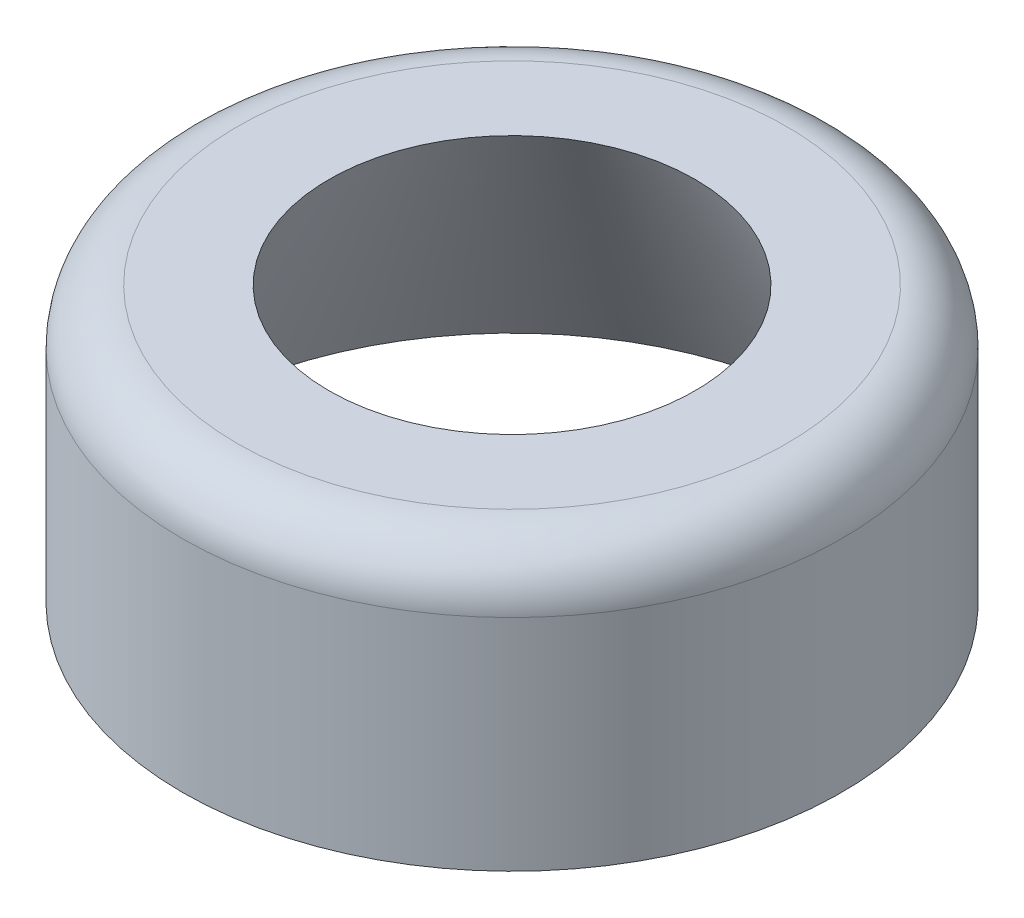
ISO-10303-21;
HEADER;
FILE_DESCRIPTION(('STEP AP214'),'2;1');
FILE_NAME('part.step','',(''),(''),'','','');
FILE_SCHEMA(('AUTOMOTIVE_DESIGN { 1 0 10303 214 1 1 1 1 }'));
ENDSEC;
DATA;
#1=APPLICATION_CONTEXT('core data for automotive mechanical design processes');
#2=APPLICATION_PROTOCOL_DEFINITION('international standard','automotive_design',2000,#1);
#3=PRODUCT_CONTEXT('',#1,'mechanical');
#4=PRODUCT('Part','Part','',(#3));
#5=PRODUCT_RELATED_PRODUCT_CATEGORY('part','',(#4));
#6=PRODUCT_DEFINITION_FORMATION('','',#4);
#7=PRODUCT_DEFINITION_CONTEXT('part definition',#1,'design');
#8=PRODUCT_DEFINITION('design','',#6,#7);
#9=PRODUCT_DEFINITION_SHAPE('','',#8);
#10=(LENGTH_UNIT() NAMED_UNIT(*) SI_UNIT(.MILLI.,.METRE.));
#11=(NAMED_UNIT(*) PLANE_ANGLE_UNIT() SI_UNIT($,.RADIAN.));
#12=(NAMED_UNIT(*) SI_UNIT($,.STERADIAN.) SOLID_ANGLE_UNIT());
#13=UNCERTAINTY_MEASURE_WITH_UNIT(LENGTH_MEASURE(1.E-05),#10,'distance_accuracy_value','');
#14=(GEOMETRIC_REPRESENTATION_CONTEXT(3) GLOBAL_UNCERTAINTY_ASSIGNED_CONTEXT((#13)) GLOBAL_UNIT_ASSIGNED_CONTEXT((#10,
#11,#12)) REPRESENTATION_CONTEXT('',''));
#15=CARTESIAN_POINT('',(0.,0.,0.));
#16=DIRECTION('',(0.,0.,1.));
#17=DIRECTION('',(1.,0.,0.));
#18=AXIS2_PLACEMENT_3D('',#15,#16,#17);
#19=CARTESIAN_POINT('',(0.,0.253999999999997,0.));
#20=DIRECTION('',(0.,-1.,0.));
#21=DIRECTION('',(0.,0.,-0.999999999999999));
#22=AXIS2_PLACEMENT_3D('',#19,#20,#21);
#23=CONICAL_SURFACE('',#22,7.19666666666667,0.489957326253728);
#24=CARTESIAN_POINT('',(0.,-10.541,0.));
#25=DIRECTION('',(0.,1.,0.));
#26=DIRECTION('',(0.,0.,0.999999999999999));
#27=AXIS2_PLACEMENT_3D('',#24,#25,#26);
#28=CIRCLE('',#27,12.954);
#29=CARTESIAN_POINT('',(0.,-10.541,12.954));
#30=VERTEX_POINT('',#29);
#31=EDGE_CURVE('E12',#30,#30,#28,.T.);
#32=ORIENTED_EDGE('',*,*,#31,.F.);
#33=EDGE_LOOP('',(#32));
#34=FACE_BOUND('',#33,.T.);
#35=CARTESIAN_POINT('',(0.,0.253999999999997,0.));
#36=DIRECTION('',(0.,1.,0.));
#37=DIRECTION('',(0.,0.,0.999999999999999));
#38=AXIS2_PLACEMENT_3D('',#35,#36,#37);
#39=CIRCLE('',#38,7.19666666666667);
#40=CARTESIAN_POINT('',(0.,0.253999999999997,7.19666666666666));
#41=VERTEX_POINT('',#40);
#42=EDGE_CURVE('E57',#41,#41,#39,.T.);
#43=ORIENTED_EDGE('',*,*,#42,.T.);
#44=EDGE_LOOP('',(#43));
#45=FACE_BOUND('',#44,.T.);
#46=ADVANCED_FACE('F43',(#34,#45),#23,.F.);
#47=CARTESIAN_POINT('',(0.,31.8361016949153,0.));
#48=DIRECTION('',(0.,1.,0.));
#49=DIRECTION('',(0.,0.,0.999999999999999));
#50=AXIS2_PLACEMENT_3D('',#47,#48,#49);
#51=CYLINDRICAL_SURFACE('',#50,12.954);
#52=CARTESIAN_POINT('',(0.,-1.90500000000001,0.));
#53=DIRECTION('',(0.,1.,0.));
#54=DIRECTION('',(0.,0.,0.999999999999999));
#55=AXIS2_PLACEMENT_3D('',#52,#53,#54);
#56=CIRCLE('',#55,12.954);
#57=CARTESIAN_POINT('',(0.,-1.90500000000001,12.954));
#58=VERTEX_POINT('',#57);
#59=EDGE_CURVE('E49',#58,#58,#56,.T.);
#60=ORIENTED_EDGE('',*,*,#59,.F.);
#61=EDGE_LOOP('',(#60));
#62=FACE_BOUND('',#61,.T.);
#63=ORIENTED_EDGE('',*,*,#31,.T.);
#64=EDGE_LOOP('',(#63));
#65=FACE_BOUND('',#64,.T.);
#66=ADVANCED_FACE('F99',(#62,#65),#51,.T.);
#67=CARTESIAN_POINT('',(0.,-1.905,0.));
#68=DIRECTION('',(0.,1.,0.));
#69=DIRECTION('',(0.,0.,0.999999999999999));
#70=AXIS2_PLACEMENT_3D('',#67,#68,#69);
#71=TOROIDAL_SURFACE('',#70,10.795,2.159);
#72=CARTESIAN_POINT('',(0.,0.253999999999997,0.));
#73=DIRECTION('',(0.,1.,0.));
#74=DIRECTION('',(0.,0.,0.999999999999999));
#75=AXIS2_PLACEMENT_3D('',#72,#73,#74);
#76=CIRCLE('',#75,10.795);
#77=CARTESIAN_POINT('',(0.,0.253999999999997,10.795));
#78=VERTEX_POINT('',#77);
#79=EDGE_CURVE('E53',#78,#78,#76,.T.);
#80=ORIENTED_EDGE('',*,*,#79,.F.);
#81=EDGE_LOOP('',(#80));
#82=FACE_BOUND('',#81,.T.);
#83=ORIENTED_EDGE('',*,*,#59,.T.);
#84=EDGE_LOOP('',(#83));
#85=FACE_BOUND('',#84,.T.);
#86=ADVANCED_FACE('F96',(#82,#85),#71,.T.);
#87=CARTESIAN_POINT('',(7.61999999999999,0.253999999999997,0.));
#88=DIRECTION('',(0.,-1.,0.));
#89=DIRECTION('',(0.,0.,-0.999999999999999));
#90=AXIS2_PLACEMENT_3D('',#87,#88,#89);
#91=PLANE('',#90);
#92=ORIENTED_EDGE('',*,*,#42,.F.);
#93=EDGE_LOOP('',(#92));
#94=FACE_BOUND('',#93,.T.);
#95=ORIENTED_EDGE('',*,*,#79,.T.);
#96=EDGE_LOOP('',(#95));
#97=FACE_BOUND('',#96,.T.);
#98=ADVANCED_FACE('F94',(#94,#97),#91,.F.);
#99=CLOSED_SHELL('',(#46,#66,#86,#98));
#100=CARTESIAN_POINT('',(0.,-0.253999999999997,0.));
#101=DIRECTION('',(0.,-1.,0.));
#102=DIRECTION('',(0.,0.,-0.999999999999999));
#103=AXIS2_PLACEMENT_3D('',#100,#101,#102);
#104=CONICAL_SURFACE('',#103,8.04333333333333,0.489957326253728);
#105=CARTESIAN_POINT('',(0.,-8.509,0.));
#106=DIRECTION('',(0.,1.,0.));
#107=DIRECTION('',(0.,0.,0.999999999999999));
#108=AXIS2_PLACEMENT_3D('',#105,#106,#107);
#109=CIRCLE('',#108,12.446);
#110=CARTESIAN_POINT('',(0.,-8.509,12.446));
#111=VERTEX_POINT('',#110);
#112=EDGE_CURVE('E62',#111,#111,#109,.T.);
#113=ORIENTED_EDGE('',*,*,#112,.T.);
#114=EDGE_LOOP('',(#113));
#115=FACE_BOUND('',#114,.T.);
#116=CARTESIAN_POINT('',(0.,-0.253999999999997,0.));
#117=DIRECTION('',(0.,1.,0.));
#118=DIRECTION('',(0.,0.,0.999999999999999));
#119=AXIS2_PLACEMENT_3D('',#116,#117,#118);
#120=CIRCLE('',#119,8.04333333333333);
#121=CARTESIAN_POINT('',(0.,-0.253999999999997,8.04333333333333));
#122=VERTEX_POINT('',#121);
#123=EDGE_CURVE('E71',#122,#122,#120,.T.);
#124=ORIENTED_EDGE('',*,*,#123,.F.);
#125=EDGE_LOOP('',(#124));
#126=FACE_BOUND('',#125,.T.);
#127=ADVANCED_FACE('F78',(#115,#126),#104,.T.);
#128=CARTESIAN_POINT('',(0.,31.8361016949153,0.));
#129=DIRECTION('',(0.,1.,0.));
#130=DIRECTION('',(0.,0.,0.999999999999999));
#131=AXIS2_PLACEMENT_3D('',#128,#129,#130);
#132=CYLINDRICAL_SURFACE('',#131,12.446);
#133=CARTESIAN_POINT('',(0.,-1.90500000000001,0.));
#134=DIRECTION('',(0.,1.,0.));
#135=DIRECTION('',(0.,0.,0.999999999999999));
#136=AXIS2_PLACEMENT_3D('',#133,#134,#135);
#137=CIRCLE('',#136,12.446);
#138=CARTESIAN_POINT('',(0.,-1.90500000000001,12.446));
#139=VERTEX_POINT('',#138);
#140=EDGE_CURVE('E65',#139,#139,#137,.T.);
#141=ORIENTED_EDGE('',*,*,#140,.T.);
#142=EDGE_LOOP('',(#141));
#143=FACE_BOUND('',#142,.T.);
#144=ORIENTED_EDGE('',*,*,#112,.F.);
#145=EDGE_LOOP('',(#144));
#146=FACE_BOUND('',#145,.T.);
#147=ADVANCED_FACE('F80',(#143,#146),#132,.F.);
#148=CARTESIAN_POINT('',(0.,-1.905,0.));
#149=DIRECTION('',(0.,1.,0.));
#150=DIRECTION('',(0.,0.,0.999999999999999));
#151=AXIS2_PLACEMENT_3D('',#148,#149,#150);
#152=TOROIDAL_SURFACE('',#151,10.795,1.651);
#153=CARTESIAN_POINT('',(0.,-0.253999999999997,0.));
#154=DIRECTION('',(0.,1.,0.));
#155=DIRECTION('',(0.,0.,0.999999999999999));
#156=AXIS2_PLACEMENT_3D('',#153,#154,#155);
#157=CIRCLE('',#156,10.795);
#158=CARTESIAN_POINT('',(0.,-0.253999999999997,10.795));
#159=VERTEX_POINT('',#158);
#160=EDGE_CURVE('E68',#159,#159,#157,.T.);
#161=ORIENTED_EDGE('',*,*,#160,.T.);
#162=EDGE_LOOP('',(#161));
#163=FACE_BOUND('',#162,.T.);
#164=ORIENTED_EDGE('',*,*,#140,.F.);
#165=EDGE_LOOP('',(#164));
#166=FACE_BOUND('',#165,.T.);
#167=ADVANCED_FACE('F88',(#163,#166),#152,.F.);
#168=CARTESIAN_POINT('',(7.61999999999999,-0.253999999999997,0.));
#169=DIRECTION('',(0.,-1.,0.));
#170=DIRECTION('',(0.,0.,-0.999999999999999));
#171=AXIS2_PLACEMENT_3D('',#168,#169,#170);
#172=PLANE('',#171);
#173=ORIENTED_EDGE('',*,*,#123,.T.);
#174=EDGE_LOOP('',(#173));
#175=FACE_BOUND('',#174,.T.);
#176=ORIENTED_EDGE('',*,*,#160,.F.);
#177=EDGE_LOOP('',(#176));
#178=FACE_BOUND('',#177,.T.);
#179=ADVANCED_FACE('F75',(#175,#178),#172,.T.);
#180=CLOSED_SHELL('',(#127,#147,#167,#179));
#181=ORIENTED_CLOSED_SHELL('',*,#180,.T.);
#182=BREP_WITH_VOIDS('B2',#99,(#181));
#183=ADVANCED_BREP_SHAPE_REPRESENTATION('',(#18,#182),#14);
#184=SHAPE_DEFINITION_REPRESENTATION(#9,#183);
ENDSEC;
END-ISO-10303-21;
